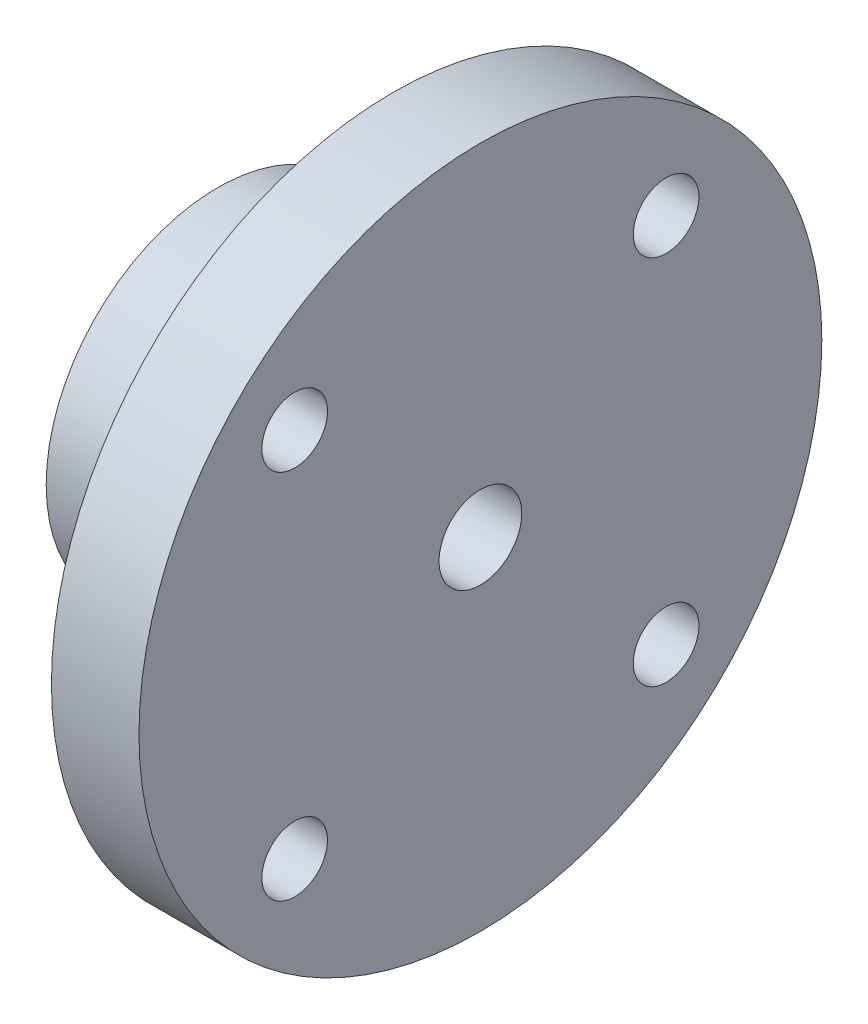
ISO-10303-21;
HEADER;
FILE_DESCRIPTION(('STEP AP214'),'2;1');
FILE_NAME('part.step','',(''),(''),'','','');
FILE_SCHEMA(('AUTOMOTIVE_DESIGN { 1 0 10303 214 1 1 1 1 }'));
ENDSEC;
DATA;
#1=APPLICATION_CONTEXT('core data for automotive mechanical design processes');
#2=APPLICATION_PROTOCOL_DEFINITION('international standard','automotive_design',2000,#1);
#3=PRODUCT_CONTEXT('',#1,'mechanical');
#4=PRODUCT('Part','Part','',(#3));
#5=PRODUCT_RELATED_PRODUCT_CATEGORY('part','',(#4));
#6=PRODUCT_DEFINITION_FORMATION('','',#4);
#7=PRODUCT_DEFINITION_CONTEXT('part definition',#1,'design');
#8=PRODUCT_DEFINITION('design','',#6,#7);
#9=PRODUCT_DEFINITION_SHAPE('','',#8);
#10=(LENGTH_UNIT() NAMED_UNIT(*) SI_UNIT(.MILLI.,.METRE.));
#11=(NAMED_UNIT(*) PLANE_ANGLE_UNIT() SI_UNIT($,.RADIAN.));
#12=(NAMED_UNIT(*) SI_UNIT($,.STERADIAN.) SOLID_ANGLE_UNIT());
#13=UNCERTAINTY_MEASURE_WITH_UNIT(LENGTH_MEASURE(1.E-05),#10,'distance_accuracy_value','');
#14=(GEOMETRIC_REPRESENTATION_CONTEXT(3) GLOBAL_UNCERTAINTY_ASSIGNED_CONTEXT((#13)) GLOBAL_UNIT_ASSIGNED_CONTEXT((#10,
#11,#12)) REPRESENTATION_CONTEXT('',''));
#15=CARTESIAN_POINT('',(0.,0.,0.));
#16=DIRECTION('',(0.,0.,1.));
#17=DIRECTION('',(1.,0.,0.));
#18=AXIS2_PLACEMENT_3D('',#15,#16,#17);
#19=CARTESIAN_POINT('',(3.175,0.,0.));
#20=DIRECTION('',(-1.,0.,0.));
#21=DIRECTION('',(0.,0.,1.));
#22=AXIS2_PLACEMENT_3D('',#19,#20,#21);
#23=CYLINDRICAL_SURFACE('',#22,12.3825);
#24=CARTESIAN_POINT('',(0.,0.,0.));
#25=DIRECTION('',(-1.,0.,0.));
#26=DIRECTION('',(0.,0.,1.));
#27=AXIS2_PLACEMENT_3D('',#24,#25,#26);
#28=CIRCLE('',#27,12.3825);
#29=CARTESIAN_POINT('',(0.,0.,12.3825));
#30=VERTEX_POINT('',#29);
#31=EDGE_CURVE('E19',#30,#30,#28,.F.);
#32=ORIENTED_EDGE('',*,*,#31,.T.);
#33=EDGE_LOOP('',(#32));
#34=FACE_BOUND('',#33,.T.);
#35=CARTESIAN_POINT('',(3.175,0.,0.));
#36=DIRECTION('',(-1.,0.,0.));
#37=DIRECTION('',(0.,0.,1.));
#38=AXIS2_PLACEMENT_3D('',#35,#36,#37);
#39=CIRCLE('',#38,12.3825);
#40=CARTESIAN_POINT('',(3.175,0.,12.3825));
#41=VERTEX_POINT('',#40);
#42=EDGE_CURVE('E75',#41,#41,#39,.F.);
#43=ORIENTED_EDGE('',*,*,#42,.F.);
#44=EDGE_LOOP('',(#43));
#45=FACE_BOUND('',#44,.T.);
#46=ADVANCED_FACE('F15',(#34,#45),#23,.T.);
#47=CARTESIAN_POINT('',(3.175,-6.735192091,-6.735192091));
#48=DIRECTION('',(-1.,0.,0.));
#49=DIRECTION('',(0.,0.,1.));
#50=AXIS2_PLACEMENT_3D('',#47,#48,#49);
#51=CYLINDRICAL_SURFACE('',#50,1.190625);
#52=CARTESIAN_POINT('',(0.,-6.735192091,-6.735192091));
#53=DIRECTION('',(-1.,0.,0.));
#54=DIRECTION('',(0.,0.,1.));
#55=AXIS2_PLACEMENT_3D('',#52,#53,#54);
#56=CIRCLE('',#55,1.190625);
#57=CARTESIAN_POINT('',(0.,-6.735192091,-5.544567091));
#58=VERTEX_POINT('',#57);
#59=EDGE_CURVE('E85',#58,#58,#56,.T.);
#60=ORIENTED_EDGE('',*,*,#59,.T.);
#61=EDGE_LOOP('',(#60));
#62=FACE_BOUND('',#61,.T.);
#63=CARTESIAN_POINT('',(3.175,-6.735192091,-6.735192091));
#64=DIRECTION('',(-1.,0.,0.));
#65=DIRECTION('',(0.,0.,1.));
#66=AXIS2_PLACEMENT_3D('',#63,#64,#65);
#67=CIRCLE('',#66,1.190625);
#68=CARTESIAN_POINT('',(3.175,-6.735192091,-5.544567091));
#69=VERTEX_POINT('',#68);
#70=EDGE_CURVE('E150',#69,#69,#67,.T.);
#71=ORIENTED_EDGE('',*,*,#70,.F.);
#72=EDGE_LOOP('',(#71));
#73=FACE_BOUND('',#72,.T.);
#74=ADVANCED_FACE('F155',(#62,#73),#51,.F.);
#75=CARTESIAN_POINT('',(3.175,-6.735192091,6.735192091));
#76=DIRECTION('',(-1.,0.,0.));
#77=DIRECTION('',(0.,0.,1.));
#78=AXIS2_PLACEMENT_3D('',#75,#76,#77);
#79=CYLINDRICAL_SURFACE('',#78,1.190625);
#80=CARTESIAN_POINT('',(0.,-6.735192091,6.735192091));
#81=DIRECTION('',(-1.,0.,0.));
#82=DIRECTION('',(0.,0.,1.));
#83=AXIS2_PLACEMENT_3D('',#80,#81,#82);
#84=CIRCLE('',#83,1.190625);
#85=CARTESIAN_POINT('',(0.,-6.735192091,7.925817091));
#86=VERTEX_POINT('',#85);
#87=EDGE_CURVE('E83',#86,#86,#84,.T.);
#88=ORIENTED_EDGE('',*,*,#87,.T.);
#89=EDGE_LOOP('',(#88));
#90=FACE_BOUND('',#89,.T.);
#91=CARTESIAN_POINT('',(3.175,-6.735192091,6.735192091));
#92=DIRECTION('',(-1.,0.,0.));
#93=DIRECTION('',(0.,0.,1.));
#94=AXIS2_PLACEMENT_3D('',#91,#92,#93);
#95=CIRCLE('',#94,1.190625);
#96=CARTESIAN_POINT('',(3.175,-6.735192091,7.925817091));
#97=VERTEX_POINT('',#96);
#98=EDGE_CURVE('E146',#97,#97,#95,.T.);
#99=ORIENTED_EDGE('',*,*,#98,.F.);
#100=EDGE_LOOP('',(#99));
#101=FACE_BOUND('',#100,.T.);
#102=ADVANCED_FACE('F159',(#90,#101),#79,.F.);
#103=CARTESIAN_POINT('',(3.175,6.735192091,6.735192091));
#104=DIRECTION('',(-1.,0.,0.));
#105=DIRECTION('',(0.,0.,1.));
#106=AXIS2_PLACEMENT_3D('',#103,#104,#105);
#107=CYLINDRICAL_SURFACE('',#106,1.190625);
#108=CARTESIAN_POINT('',(0.,6.735192091,6.735192091));
#109=DIRECTION('',(-1.,0.,0.));
#110=DIRECTION('',(0.,0.,1.));
#111=AXIS2_PLACEMENT_3D('',#108,#109,#110);
#112=CIRCLE('',#111,1.190625);
#113=CARTESIAN_POINT('',(0.,6.735192091,7.925817091));
#114=VERTEX_POINT('',#113);
#115=EDGE_CURVE('E80',#114,#114,#112,.T.);
#116=ORIENTED_EDGE('',*,*,#115,.T.);
#117=EDGE_LOOP('',(#116));
#118=FACE_BOUND('',#117,.T.);
#119=CARTESIAN_POINT('',(3.175,6.735192091,6.735192091));
#120=DIRECTION('',(-1.,0.,0.));
#121=DIRECTION('',(0.,0.,1.));
#122=AXIS2_PLACEMENT_3D('',#119,#120,#121);
#123=CIRCLE('',#122,1.190625);
#124=CARTESIAN_POINT('',(3.175,6.735192091,7.925817091));
#125=VERTEX_POINT('',#124);
#126=EDGE_CURVE('E142',#125,#125,#123,.T.);
#127=ORIENTED_EDGE('',*,*,#126,.F.);
#128=EDGE_LOOP('',(#127));
#129=FACE_BOUND('',#128,.T.);
#130=ADVANCED_FACE('F163',(#118,#129),#107,.F.);
#131=CARTESIAN_POINT('',(3.175,6.735192091,-6.735192091));
#132=DIRECTION('',(-1.,0.,0.));
#133=DIRECTION('',(0.,0.,1.));
#134=AXIS2_PLACEMENT_3D('',#131,#132,#133);
#135=CYLINDRICAL_SURFACE('',#134,1.190625);
#136=CARTESIAN_POINT('',(0.,6.735192091,-6.735192091));
#137=DIRECTION('',(-1.,0.,0.));
#138=DIRECTION('',(0.,0.,1.));
#139=AXIS2_PLACEMENT_3D('',#136,#137,#138);
#140=CIRCLE('',#139,1.190625);
#141=CARTESIAN_POINT('',(0.,6.735192091,-5.544567091));
#142=VERTEX_POINT('',#141);
#143=EDGE_CURVE('E76',#142,#142,#140,.T.);
#144=ORIENTED_EDGE('',*,*,#143,.T.);
#145=EDGE_LOOP('',(#144));
#146=FACE_BOUND('',#145,.T.);
#147=CARTESIAN_POINT('',(3.175,6.735192091,-6.735192091));
#148=DIRECTION('',(-1.,0.,0.));
#149=DIRECTION('',(0.,0.,1.));
#150=AXIS2_PLACEMENT_3D('',#147,#148,#149);
#151=CIRCLE('',#150,1.190625);
#152=CARTESIAN_POINT('',(3.175,6.735192091,-5.544567091));
#153=VERTEX_POINT('',#152);
#154=EDGE_CURVE('E56',#153,#153,#151,.T.);
#155=ORIENTED_EDGE('',*,*,#154,.F.);
#156=EDGE_LOOP('',(#155));
#157=FACE_BOUND('',#156,.T.);
#158=ADVANCED_FACE('F64',(#146,#157),#135,.F.);
#159=CARTESIAN_POINT('',(-3.175,6.25695273025488,0.));
#160=DIRECTION('',(0.,-1.,0.));
#161=DIRECTION('',(1.,0.,0.));
#162=AXIS2_PLACEMENT_3D('',#159,#160,#161);
#163=CYLINDRICAL_SURFACE('',#162,1.3890625);
#164=CARTESIAN_POINT('',(-3.17500000011396,6.06598997452961,1.3890625));
#165=CARTESIAN_POINT('',(-3.09811006415944,6.06599217922672,1.38905868040349));
#166=CARTESIAN_POINT('',(-3.02112666446025,6.06746937541811,1.38265024311988));
#167=CARTESIAN_POINT('',(-2.86928741773819,6.07321250864021,1.35719635145861));
#168=CARTESIAN_POINT('',(-2.79443600498068,6.07748386985381,1.33812631662936));
#169=CARTESIAN_POINT('',(-2.64917546517182,6.08830741725932,1.28798075919054));
#170=CARTESIAN_POINT('',(-2.57875941837421,6.09485594117176,1.25692450482905));
#171=CARTESIAN_POINT('',(-2.44415685156192,6.10949118253794,1.18373673504967));
#172=CARTESIAN_POINT('',(-2.37996851798402,6.11757745014493,1.14160845723362));
#173=CARTESIAN_POINT('',(-2.2584811026932,6.13453833085786,1.0466728938705));
#174=CARTESIAN_POINT('',(-2.2013079484898,6.14342344393786,0.993706294264336));
#175=CARTESIAN_POINT('',(-2.09657645865613,6.16088945408051,0.878938922914779));
#176=CARTESIAN_POINT('',(-2.04901940871729,6.16947031033715,0.817136971751238));
#177=CARTESIAN_POINT('',(-1.96437777314316,6.18547403954004,0.685615995342867));
#178=CARTESIAN_POINT('',(-1.9274135723458,6.19288320263398,0.615817683132399));
#179=CARTESIAN_POINT('',(-1.86578675756034,6.20559097929397,0.470807350225378));
#180=CARTESIAN_POINT('',(-1.84112260430311,6.21088985693149,0.395596008282198));
#181=CARTESIAN_POINT('',(-1.80518978319658,6.21870644289575,0.24319461858624));
#182=CARTESIAN_POINT('',(-1.79370940378417,6.22126805947162,0.166056777849254));
#183=CARTESIAN_POINT('',(-1.78380773707804,6.22347374938127,0.0109102014321965));
#184=CARTESIAN_POINT('',(-1.78538491517028,6.22311816556456,-0.0670984308303188));
#185=CARTESIAN_POINT('',(-1.80139661763737,6.21956296294512,-0.220310792785113));
#186=CARTESIAN_POINT('',(-1.81560280052543,6.21641385520967,-0.295539730809042));
#187=CARTESIAN_POINT('',(-1.85610513553392,6.20768312867522,-0.442518624580058));
#188=CARTESIAN_POINT('',(-1.88240193416664,6.20210137979828,-0.514268394061386));
#189=CARTESIAN_POINT('',(-1.9465395478409,6.18905165545756,-0.652883185654913));
#190=CARTESIAN_POINT('',(-1.98446653435117,6.1815696742105,-0.719706963092924));
#191=CARTESIAN_POINT('',(-2.07072071519305,6.16553942255323,-0.846119641666087));
#192=CARTESIAN_POINT('',(-2.1190486496397,6.15699107628036,-0.905708027469951));
#193=CARTESIAN_POINT('',(-2.22596430024307,6.13954947547536,-1.01731254714392));
#194=CARTESIAN_POINT('',(-2.28475012719988,6.13065275651723,-1.06913849995622));
#195=CARTESIAN_POINT('',(-2.41029910600272,6.11368469116566,-1.16225489314144));
#196=CARTESIAN_POINT('',(-2.47706577556011,6.10561371166338,-1.20354066239596));
#197=CARTESIAN_POINT('',(-2.61701658588749,6.0912000747929,-1.27449273562706));
#198=CARTESIAN_POINT('',(-2.69022511471871,6.08486439480695,-1.30411233469653));
#199=CARTESIAN_POINT('',(-2.84066408078581,6.07473592245639,-1.35051307820957));
#200=CARTESIAN_POINT('',(-2.91788567571255,6.0709377752913,-1.36732126842029));
#201=CARTESIAN_POINT('',(-3.02559826954119,6.06775615915351,-1.38133049127282));
#202=CARTESIAN_POINT('',(-3.05539688525944,6.06709548584937,-1.38422736042052));
#203=CARTESIAN_POINT('',(-3.1151256086696,6.06621196369546,-1.3880941109171));
#204=CARTESIAN_POINT('',(-3.14505571668523,6.06598911592419,-1.38906398751922));
#205=CARTESIAN_POINT('',(-3.25188993594891,6.06599217922808,-1.38905868039756));
#206=CARTESIAN_POINT('',(-3.32887333564875,6.06746937542088,-1.38265024310781));
#207=CARTESIAN_POINT('',(-3.48071258237093,6.0732125086457,-1.35719635143408));
#208=CARTESIAN_POINT('',(-3.55556399512791,6.07748386986063,-1.33812631659853));
#209=CARTESIAN_POINT('',(-3.70082453493354,6.08830741726845,-1.28798075914753));
#210=CARTESIAN_POINT('',(-3.77124058172852,6.09485594118184,-1.25692450478031));
#211=CARTESIAN_POINT('',(-3.9058431485347,6.10949118254953,-1.18373673499001));
#212=CARTESIAN_POINT('',(-3.97003148210912,6.11757745015707,-1.14160845716875));
#213=CARTESIAN_POINT('',(-4.09151889739249,6.1345383308707,-1.04667289379549));
#214=CARTESIAN_POINT('',(-4.14869205159187,6.14342344395084,-0.993706294184351));
#215=CARTESIAN_POINT('',(-4.25342354141668,6.16088945409329,-0.87893892282549));
#216=CARTESIAN_POINT('',(-4.30098059135068,6.16947031034959,-0.817136971657625));
#217=CARTESIAN_POINT('',(-4.38562222691409,6.18547403955128,-0.685615995241783));
#218=CARTESIAN_POINT('',(-4.42258642770562,6.19288320264437,-0.615817683028224));
#219=CARTESIAN_POINT('',(-4.48421324247897,6.2055909793023,-0.470807350116047));
#220=CARTESIAN_POINT('',(-4.50887739572993,6.2108898569386,-0.395596008170801));
#221=CARTESIAN_POINT('',(-4.54481021682364,6.21870644290022,-0.243194618472236));
#222=CARTESIAN_POINT('',(-4.55629059622957,6.22126805947468,-0.166056777734705));
#223=CARTESIAN_POINT('',(-4.56619226292284,6.22347374938147,-0.0109102013177001));
#224=CARTESIAN_POINT('',(-4.56461508482419,6.22311816556332,0.0670984309442183));
#225=CARTESIAN_POINT('',(-4.54860338234466,6.21956296294115,0.220310792897062));
#226=CARTESIAN_POINT('',(-4.53439719945051,6.21641385520439,0.29553973091965));
#227=CARTESIAN_POINT('',(-4.49389486443019,6.20768312866758,0.442518624686999));
#228=CARTESIAN_POINT('',(-4.46759806579172,6.20210137978958,0.514268394166));
#229=CARTESIAN_POINT('',(-4.40346045210623,6.18905165544704,0.65288318575443));
#230=CARTESIAN_POINT('',(-4.36553346559039,6.18156967419921,0.719706963189629));
#231=CARTESIAN_POINT('',(-4.27927928473785,6.16553942254082,0.846119641756289));
#232=CARTESIAN_POINT('',(-4.23095135028612,6.1569910762676,0.905708027556461));
#233=CARTESIAN_POINT('',(-4.12403569967312,6.13954947546237,1.01731254722213));
#234=CARTESIAN_POINT('',(-4.06524987271179,6.13065275650436,1.0691385000298));
#235=CARTESIAN_POINT('',(-3.93970089390062,6.11368469115353,1.16225489320506));
#236=CARTESIAN_POINT('',(-3.87293422433943,6.10561371165185,1.20354066245424));
#237=CARTESIAN_POINT('',(-3.73298341400583,6.09120007478309,1.27449273567376));
#238=CARTESIAN_POINT('',(-3.65977488517223,6.08486439479823,1.30411233473707));
#239=CARTESIAN_POINT('',(-3.50933591910154,6.07473592245017,1.35051307823744));
#240=CARTESIAN_POINT('',(-3.43211432417358,6.07093777528646,1.36732126844168));
#241=CARTESIAN_POINT('',(-3.32440173038084,6.06775615915177,1.38133049128045));
#242=CARTESIAN_POINT('',(-3.29460311469942,6.06709548584874,1.38422736042327));
#243=CARTESIAN_POINT('',(-3.23487439136325,6.06621196369597,1.38809411091488));
#244=CARTESIAN_POINT('',(-3.20494428338477,6.06598911592473,1.38906398751691));
#245=CARTESIAN_POINT('',(-3.17500000011396,6.06598997452961,1.3890625));
#246=B_SPLINE_CURVE_WITH_KNOTS('',3,(#164,#165,#166,#167,#168,#169,#170,#171,#172,#173,#174,
#175,#176,#177,#178,#179,#180,#181,#182,#183,#184,#185,#186,#187,#188,#189,#190,#191,#192,#193,
#194,#195,#196,#197,#198,#199,#200,#201,#202,#203,#204,#205,#206,#207,#208,#209,#210,#211,#212,
#213,#214,#215,#216,#217,#218,#219,#220,#221,#222,#223,#224,#225,#226,#227,#228,#229,#230,#231,
#232,#233,#234,#235,#236,#237,#238,#239,#240,#241,#242,#243,#244,#245),.UNSPECIFIED.,.T.,.F.,(4,
2,2,2,2,2,2,2,2,2,2,2,2,2,2,2,2,2,2,2,2,2,2,2,2,2,2,2,2,2,2,2,2,2,2,2,2,2,2,2,4),(0.,
0.230555019325299,0.4615589379102,0.692193046371755,0.922759789348866,1.1569966984772,
1.39126490484742,1.62809853413737,1.86490251783189,2.09784813553214,2.33076637624882,
2.55955705179012,2.78835996270408,3.01890086925003,3.24945818615037,3.48496868375749,
3.72058337264286,3.95713197132167,4.19317980583598,4.28296773093861,4.37275587721589,
4.60331089654477,4.83431481513295,5.06494892359447,5.29551566657162,5.52975257570126,
5.76402078207277,6.00085441136249,6.23765839505677,6.47060401275565,6.70352225347098,
6.93231292901189,7.16111583992548,7.39165674647255,7.622214063374,7.85772456098207,
8.09333924986847,8.32988784854673,8.56593568306014,8.65572360805157,8.74551175421765),.UNSPECIFIED.);
#247=CARTESIAN_POINT('',(-3.17500000011396,6.06598997452961,1.3890625));
#248=VERTEX_POINT('',#247);
#249=EDGE_CURVE('E69',#248,#248,#246,.T.);
#250=ORIENTED_EDGE('',*,*,#249,.T.);
#251=EDGE_LOOP('',(#250));
#252=FACE_BOUND('',#251,.T.);
#253=CARTESIAN_POINT('',(-3.17500000265396,0.566131937890353,1.38906250002586));
#254=CARTESIAN_POINT('',(-3.13694451784908,0.56613637078519,1.3890613503542));
#255=CARTESIAN_POINT('',(-3.09888214365958,0.570073242006744,1.38747438867191));
#256=CARTESIAN_POINT('',(-3.02424248625585,0.584696740501921,1.38137125987598));
#257=CARTESIAN_POINT('',(-2.98767378761954,0.59541776293997,1.37684016304787));
#258=CARTESIAN_POINT('',(-2.89791294412656,0.628256170940902,1.36225982524225));
#259=CARTESIAN_POINT('',(-2.84615597103486,0.653402039732897,1.35055961884621));
#260=CARTESIAN_POINT('',(-2.74674985574123,0.708660042943076,1.32241381769489));
#261=CARTESIAN_POINT('',(-2.69911754037834,0.738791183495466,1.30594987420841));
#262=CARTESIAN_POINT('',(-2.6098272496381,0.799328395105556,1.26974272726648));
#263=CARTESIAN_POINT('',(-2.5679824599643,0.829611791730389,1.2502524433848));
#264=CARTESIAN_POINT('',(-2.48675099896436,0.89077679967322,1.20744222916994));
#265=CARTESIAN_POINT('',(-2.44736616349926,0.92165883575575,1.18411948471273));
#266=CARTESIAN_POINT('',(-2.33278147894618,1.01377724728472,1.10839860025836));
#267=CARTESIAN_POINT('',(-2.26094544870498,1.07463651324975,1.05016371346534));
#268=CARTESIAN_POINT('',(-2.14503469861716,1.17505984083077,0.93461893178728));
#269=CARTESIAN_POINT('',(-2.09857575229599,1.21607083517548,0.880935752729396));
#270=CARTESIAN_POINT('',(-2.01298069408482,1.29244487244515,0.764466639505674));
#271=CARTESIAN_POINT('',(-1.97383175455568,1.32781779281122,0.701697000684656));
#272=CARTESIAN_POINT('',(-1.91196107195702,1.38406863900515,0.581229147426247));
#273=CARTESIAN_POINT('',(-1.88751725973316,1.40643148093303,0.525115255285228));
#274=CARTESIAN_POINT('',(-1.84581476263747,1.44470387018345,0.408173135640683));
#275=CARTESIAN_POINT('',(-1.82855186843281,1.46061719796131,0.347347694844339));
#276=CARTESIAN_POINT('',(-1.80228639744449,1.48486442987423,0.221983583654817));
#277=CARTESIAN_POINT('',(-1.79334115114988,1.49314572580644,0.157422352977044));
#278=CARTESIAN_POINT('',(-1.78467269877125,1.50117033984526,0.0271617910189906));
#279=CARTESIAN_POINT('',(-1.78494504873747,1.50091777226331,-0.0385369765667989));
#280=CARTESIAN_POINT('',(-1.79412461250375,1.49242087420961,-0.16139712678156));
#281=CARTESIAN_POINT('',(-1.80207156961796,1.48506528930177,-0.218697773635406));
#282=CARTESIAN_POINT('',(-1.82468420661982,1.46418556247626,-0.330774167287795));
#283=CARTESIAN_POINT('',(-1.83935090578185,1.45066048474934,-0.385549529654413));
#284=CARTESIAN_POINT('',(-1.87527669356705,1.41765070410367,-0.493538522818222));
#285=CARTESIAN_POINT('',(-1.89677086264733,1.39795389060207,-0.546607627042664));
#286=CARTESIAN_POINT('',(-1.94512404440145,1.35388415735177,-0.648125549859769));
#287=CARTESIAN_POINT('',(-1.97198568250177,1.32950894945953,-0.696572090184636));
#288=CARTESIAN_POINT('',(-2.0454352092702,1.26334619001965,-0.812688909989209));
#289=CARTESIAN_POINT('',(-2.09498013328373,1.219131238794,-0.877115358415202));
#290=CARTESIAN_POINT('',(-2.20203301706007,1.12538928566003,-0.994574695116265));
#291=CARTESIAN_POINT('',(-2.25956318044789,1.07584756191356,-1.04757472408646));
#292=CARTESIAN_POINT('',(-2.3827555349153,0.973101906664263,-1.14372797309536));
#293=CARTESIAN_POINT('',(-2.44858475125593,0.919837455631937,-1.18660265591469));
#294=CARTESIAN_POINT('',(-2.55256343394237,0.84109300581107,-1.24241881907491));
#295=CARTESIAN_POINT('',(-2.58807725406096,0.815049062988456,-1.25960204545565));
#296=CARTESIAN_POINT('',(-2.66112563861144,0.764120265173408,-1.29112809331476));
#297=CARTESIAN_POINT('',(-2.69865860684696,0.739234522794626,-1.30547311769878));
#298=CARTESIAN_POINT('',(-2.77364160187412,0.693376586155886,-1.33036234118494));
#299=CARTESIAN_POINT('',(-2.81093622442226,0.672254846135701,-1.3410938754599));
#300=CARTESIAN_POINT('',(-2.88813823798127,0.633779433072223,-1.35969757671414));
#301=CARTESIAN_POINT('',(-2.92804202237812,0.616420696033295,-1.36757359617888));
#302=CARTESIAN_POINT('',(-3.00229436226329,0.591086067226802,-1.37868479675069));
#303=CARTESIAN_POINT('',(-3.03612511006408,0.581920547775767,-1.38253765739833));
#304=CARTESIAN_POINT('',(-3.10497221567012,0.569453291228777,-1.38772194274289));
#305=CARTESIAN_POINT('',(-3.13998319225981,0.566127858673159,-1.38906355798687));
#306=CARTESIAN_POINT('',(-3.21305548715231,0.566136371082025,-1.38906135020356));
#307=CARTESIAN_POINT('',(-3.25111786173776,0.570073242708159,-1.38747438837839));
#308=CARTESIAN_POINT('',(-3.32575751985897,0.584696742062274,-1.38137125922625));
#309=CARTESIAN_POINT('',(-3.36232621881543,0.595417764958383,-1.37684016218294));
#310=CARTESIAN_POINT('',(-3.45208706361194,0.628256174292068,-1.36225982370817));
#311=CARTESIAN_POINT('',(-3.50384403759931,0.653402044051901,-1.35055961678063));
#312=CARTESIAN_POINT('',(-3.60325015456329,0.708660049151038,-1.32241381439627));
#313=CARTESIAN_POINT('',(-3.65088247070139,0.738791190623273,-1.30594987020866));
#314=CARTESIAN_POINT('',(-3.74017276216121,0.799328403462266,-1.26974272201989));
#315=CARTESIAN_POINT('',(-3.78201755183083,0.829611800369996,-1.25025243766614));
#316=CARTESIAN_POINT('',(-3.86324901281811,0.89077680878499,-1.20744222246261));
#317=CARTESIAN_POINT('',(-3.90263384827479,0.921658845056703,-1.18411947748886));
#318=CARTESIAN_POINT('',(-4.01721853275713,1.01377725702965,-1.10839859141072));
#319=CARTESIAN_POINT('',(-4.08905456290205,1.0746365231357,-1.05016370342954));
#320=CARTESIAN_POINT('',(-4.20496531174037,1.17505984992365,-0.934618920326513));
#321=CARTESIAN_POINT('',(-4.25142425707006,1.21607084347469,-0.880935741233161));
#322=CARTESIAN_POINT('',(-4.3370193133484,1.29244487913655,-0.764466628147812));
#323=CARTESIAN_POINT('',(-4.37616825193581,1.32781779868828,-0.701696989499867));
#324=CARTESIAN_POINT('',(-4.43803893309214,1.38406864361493,-0.581229136437874));
#325=CARTESIAN_POINT('',(-4.46248274476245,1.40643148504983,-0.525115244240474));
#326=CARTESIAN_POINT('',(-4.50418524074402,1.44470387329595,-0.408173124600383));
#327=CARTESIAN_POINT('',(-4.52144813438816,1.46061720056254,-0.347347683864829));
#328=CARTESIAN_POINT('',(-4.54771360427445,1.48486443146408,-0.221983572951449));
#329=CARTESIAN_POINT('',(-4.55665885002963,1.49314572689807,-0.15742234249074));
#330=CARTESIAN_POINT('',(-4.56532730140783,1.50117034001133,-0.0271617811028737));
#331=CARTESIAN_POINT('',(-4.56505495098014,1.5009177720016,0.0385369861299129));
#332=CARTESIAN_POINT('',(-4.55587538643722,1.49242087322957,0.161397135800598));
#333=CARTESIAN_POINT('',(-4.54792842896866,1.48506528799474,0.218697782469582));
#334=CARTESIAN_POINT('',(-4.52531579131528,1.46418556057157,0.330774175692347));
#335=CARTESIAN_POINT('',(-4.510649091856,1.45066048257392,0.385549537814171));
#336=CARTESIAN_POINT('',(-4.474723303444,1.41765070136256,0.493538530700907));
#337=CARTESIAN_POINT('',(-4.45322913400733,1.39795388754201,0.546607634873803));
#338=CARTESIAN_POINT('',(-4.40487595155781,1.35388415367992,0.648125557534267));
#339=CARTESIAN_POINT('',(-4.37801431311854,1.32950894549489,0.69657209775404));
#340=CARTESIAN_POINT('',(-4.30456478537636,1.26334618522771,0.81268891746823));
#341=CARTESIAN_POINT('',(-4.25501986070703,1.21913123346084,0.877115365847694));
#342=CARTESIAN_POINT('',(-4.14796697559486,1.12538927929943,0.994574702331628));
#343=CARTESIAN_POINT('',(-4.09043681152632,1.0758475550665,1.04757473112991));
#344=CARTESIAN_POINT('',(-3.96724445562031,0.973101898934214,1.14372797968203));
#345=CARTESIAN_POINT('',(-3.90141523851952,0.919837447507735,1.18660266221196));
#346=CARTESIAN_POINT('',(-3.79743655458024,0.841092997304859,1.24241882483369));
#347=CARTESIAN_POINT('',(-3.76192273402518,0.815049054389554,1.25960205101777));
#348=CARTESIAN_POINT('',(-3.68887434854058,0.76412025651148,1.2911280984389));
#349=CARTESIAN_POINT('',(-3.65134137980765,0.73923451416217,1.30547312258188));
#350=CARTESIAN_POINT('',(-3.57635838445162,0.693376578233693,1.33036234529984));
#351=CARTESIAN_POINT('',(-3.53906376212069,0.67225483883931,1.34109387910326));
#352=CARTESIAN_POINT('',(-3.46186174903482,0.633779427190466,1.3596975794434));
#353=CARTESIAN_POINT('',(-3.42195796489589,0.616420690937363,1.36757359846767));
#354=CARTESIAN_POINT('',(-3.34770562791083,0.591086064470358,1.37868479791572));
#355=CARTESIAN_POINT('',(-3.31387488285669,0.58192054625345,1.38253765802866));
#356=CARTESIAN_POINT('',(-3.2450277829758,0.569453291221004,1.38772194274846));
#357=CARTESIAN_POINT('',(-3.21001680936198,0.56612785895607,1.38906355789782));
#358=CARTESIAN_POINT('',(-3.17500000265396,0.566131937890353,1.38906250002586));
#359=B_SPLINE_CURVE_WITH_KNOTS('',3,(#253,#254,#255,#256,#257,#258,#259,#260,#261,#262,#263,
#264,#265,#266,#267,#268,#269,#270,#271,#272,#273,#274,#275,#276,#277,#278,#279,#280,#281,#282,
#283,#284,#285,#286,#287,#288,#289,#290,#291,#292,#293,#294,#295,#296,#297,#298,#299,#300,#301,
#302,#303,#304,#305,#306,#307,#308,#309,#310,#311,#312,#313,#314,#315,#316,#317,#318,#319,#320,
#321,#322,#323,#324,#325,#326,#327,#328,#329,#330,#331,#332,#333,#334,#335,#336,#337,#338,#339,
#340,#341,#342,#343,#344,#345,#346,#347,#348,#349,#350,#351,#352,#353,#354,#355,#356,#357,#358),
.UNSPECIFIED.,.T.,.F.,(4,2,2,2,2,2,2,2,2,2,2,2,2,2,2,2,2,2,2,2,2,2,2,2,2,2,2,2,2,2,2,2,2,2,2,2,
2,2,2,2,2,2,2,2,2,2,2,2,2,2,2,2,4),(0.,0.113992115833275,0.228566845395369,0.40372851220296,
0.579574050068104,0.744972992175249,0.910493931696776,1.24073847974711,1.48590456963309,
1.73063631230884,1.9253633616509,2.11997610388424,2.31592050720931,2.51177044396743,
2.68591637348403,2.86008872682451,3.04106292417412,3.22212586030935,3.49815072980797,
3.77495908639672,4.05867085714783,4.20039137588073,4.34200146120117,4.47434162176377,
4.6065025667959,4.71182089032738,4.81671090135588,4.93070301849743,5.04527774943324,
5.22043942015351,5.396284961907,5.56168390497111,5.72720484544603,6.05744939535448,
6.3026154824455,6.54734722234176,6.74207427069823,6.93668701194558,7.13263141423358,
7.32848134996427,7.50262727921171,7.67679963228469,7.85777383018968,8.03883676687957,
8.31486163810051,8.59166999643905,8.87538176902438,9.01710228867594,9.15871237490172,
9.29105253366895,9.42321347680887,9.52853179139744,9.63342179363598),.UNSPECIFIED.);
#360=CARTESIAN_POINT('',(-3.17500000265396,0.566131937890353,1.38906250002586));
#361=VERTEX_POINT('',#360);
#362=EDGE_CURVE('E49',#361,#361,#359,.T.);
#363=ORIENTED_EDGE('',*,*,#362,.F.);
#364=EDGE_LOOP('',(#363));
#365=FACE_BOUND('',#364,.T.);
#366=ADVANCED_FACE('F59',(#252,#365),#163,.F.);
#367=CARTESIAN_POINT('',(0.,-12.53109,12.53109));
#368=DIRECTION('',(1.,0.,0.));
#369=DIRECTION('',(0.,0.,-1.));
#370=AXIS2_PLACEMENT_3D('',#367,#368,#369);
#371=PLANE('',#370);
#372=CARTESIAN_POINT('',(0.,0.,0.));
#373=DIRECTION('',(1.,0.,0.));
#374=DIRECTION('',(0.,0.,-1.));
#375=AXIS2_PLACEMENT_3D('',#372,#373,#374);
#376=CIRCLE('',#375,6.223);
#377=CARTESIAN_POINT('',(0.,0.,-6.223));
#378=VERTEX_POINT('',#377);
#379=EDGE_CURVE('E55',#378,#378,#376,.T.);
#380=ORIENTED_EDGE('',*,*,#379,.T.);
#381=EDGE_LOOP('',(#380));
#382=FACE_BOUND('',#381,.T.);
#383=ORIENTED_EDGE('',*,*,#143,.F.);
#384=EDGE_LOOP('',(#383));
#385=FACE_BOUND('',#384,.T.);
#386=ORIENTED_EDGE('',*,*,#115,.F.);
#387=EDGE_LOOP('',(#386));
#388=FACE_BOUND('',#387,.T.);
#389=ORIENTED_EDGE('',*,*,#87,.F.);
#390=EDGE_LOOP('',(#389));
#391=FACE_BOUND('',#390,.T.);
#392=ORIENTED_EDGE('',*,*,#59,.F.);
#393=EDGE_LOOP('',(#392));
#394=FACE_BOUND('',#393,.T.);
#395=ORIENTED_EDGE('',*,*,#31,.F.);
#396=EDGE_LOOP('',(#395));
#397=FACE_BOUND('',#396,.T.);
#398=ADVANCED_FACE('F63',(#382,#385,#388,#391,#394,#397),#371,.F.);
#399=CARTESIAN_POINT('',(-6.35,-6.297676,-6.297676));
#400=DIRECTION('',(-1.,0.,0.));
#401=DIRECTION('',(0.,0.,1.));
#402=AXIS2_PLACEMENT_3D('',#399,#400,#401);
#403=PLANE('',#402);
#404=CARTESIAN_POINT('',(-6.35,0.,0.));
#405=DIRECTION('',(1.,0.,0.));
#406=DIRECTION('',(0.,0.,-1.));
#407=AXIS2_PLACEMENT_3D('',#404,#405,#406);
#408=CIRCLE('',#407,1.5);
#409=CARTESIAN_POINT('',(-6.35,0.,-1.5));
#410=VERTEX_POINT('',#409);
#411=EDGE_CURVE('E128',#410,#410,#408,.F.);
#412=ORIENTED_EDGE('',*,*,#411,.F.);
#413=EDGE_LOOP('',(#412));
#414=FACE_BOUND('',#413,.T.);
#415=CARTESIAN_POINT('',(-6.35,0.,0.));
#416=DIRECTION('',(1.,0.,0.));
#417=DIRECTION('',(0.,0.,-1.));
#418=AXIS2_PLACEMENT_3D('',#415,#416,#417);
#419=CIRCLE('',#418,6.223);
#420=CARTESIAN_POINT('',(-6.35,0.,-6.223));
#421=VERTEX_POINT('',#420);
#422=EDGE_CURVE('E126',#421,#421,#419,.F.);
#423=ORIENTED_EDGE('',*,*,#422,.T.);
#424=EDGE_LOOP('',(#423));
#425=FACE_BOUND('',#424,.T.);
#426=ADVANCED_FACE('F95',(#414,#425),#403,.T.);
#427=CARTESIAN_POINT('',(3.175,-12.53109,12.53109));
#428=DIRECTION('',(1.,0.,0.));
#429=DIRECTION('',(0.,0.,-1.));
#430=AXIS2_PLACEMENT_3D('',#427,#428,#429);
#431=PLANE('',#430);
#432=CARTESIAN_POINT('',(3.175,0.,0.));
#433=DIRECTION('',(1.,0.,0.));
#434=DIRECTION('',(0.,0.,-1.));
#435=AXIS2_PLACEMENT_3D('',#432,#433,#434);
#436=CIRCLE('',#435,1.5);
#437=CARTESIAN_POINT('',(3.175,0.,-1.5));
#438=VERTEX_POINT('',#437);
#439=EDGE_CURVE('E28',#438,#438,#436,.T.);
#440=ORIENTED_EDGE('',*,*,#439,.F.);
#441=EDGE_LOOP('',(#440));
#442=FACE_BOUND('',#441,.T.);
#443=ORIENTED_EDGE('',*,*,#154,.T.);
#444=EDGE_LOOP('',(#443));
#445=FACE_BOUND('',#444,.T.);
#446=ORIENTED_EDGE('',*,*,#126,.T.);
#447=EDGE_LOOP('',(#446));
#448=FACE_BOUND('',#447,.T.);
#449=ORIENTED_EDGE('',*,*,#98,.T.);
#450=EDGE_LOOP('',(#449));
#451=FACE_BOUND('',#450,.T.);
#452=ORIENTED_EDGE('',*,*,#70,.T.);
#453=EDGE_LOOP('',(#452));
#454=FACE_BOUND('',#453,.T.);
#455=ORIENTED_EDGE('',*,*,#42,.T.);
#456=EDGE_LOOP('',(#455));
#457=FACE_BOUND('',#456,.T.);
#458=ADVANCED_FACE('F17',(#442,#445,#448,#451,#454,#457),#431,.T.);
#459=CARTESIAN_POINT('',(-6.35,0.,0.));
#460=DIRECTION('',(1.,0.,0.));
#461=DIRECTION('',(0.,0.,-1.));
#462=AXIS2_PLACEMENT_3D('',#459,#460,#461);
#463=CYLINDRICAL_SURFACE('',#462,6.223);
#464=ORIENTED_EDGE('',*,*,#422,.F.);
#465=EDGE_LOOP('',(#464));
#466=FACE_BOUND('',#465,.T.);
#467=ORIENTED_EDGE('',*,*,#379,.F.);
#468=EDGE_LOOP('',(#467));
#469=FACE_BOUND('',#468,.T.);
#470=CARTESIAN_POINT('',(-3.17500000014967,-6.06598997422828,1.38906249962186));
#471=CARTESIAN_POINT('',(-3.25188993612184,-6.06599217873096,1.38905867976256));
#472=CARTESIAN_POINT('',(-3.3288733358372,-6.06746937529178,1.3826502429191));
#473=CARTESIAN_POINT('',(-3.48071258255037,-6.07321250878899,1.35719635156141));
#474=CARTESIAN_POINT('',(-3.55556399528351,-6.07748386990648,1.33812631659846));
#475=CARTESIAN_POINT('',(-3.70082453505435,-6.08830741724325,1.28798075905227));
#476=CARTESIAN_POINT('',(-3.7712405818379,-6.09485594118308,1.25692450471564));
#477=CARTESIAN_POINT('',(-3.90584314863647,-6.10949118257125,1.18373673493987));
#478=CARTESIAN_POINT('',(-3.9700314822133,-6.11757745017318,1.1416084571));
#479=CARTESIAN_POINT('',(-4.09151889749694,-6.13453833088369,1.046672893701));
#480=CARTESIAN_POINT('',(-4.14869205169447,-6.14342344396642,0.993706294083276));
#481=CARTESIAN_POINT('',(-4.25342354150784,-6.16088945411003,0.87893892271423));
#482=CARTESIAN_POINT('',(-4.30098059143329,-6.16947031036491,0.817136971543705));
#483=CARTESIAN_POINT('',(-4.38562222698093,-6.18547403956422,0.685615995123328));
#484=CARTESIAN_POINT('',(-4.42258642776497,-6.19288320265631,0.61581768290773));
#485=CARTESIAN_POINT('',(-4.48421324252449,-6.20559097931198,0.470807349989793));
#486=CARTESIAN_POINT('',(-4.50887739576864,-6.21088985694695,0.395596008040615));
#487=CARTESIAN_POINT('',(-4.54481021684766,-6.21870644290552,0.243194618336962));
#488=CARTESIAN_POINT('',(-4.55629059624597,-6.22126805947832,0.166056777598315));
#489=CARTESIAN_POINT('',(-4.56619226292385,-6.2234737493817,0.0109102011813714));
#490=CARTESIAN_POINT('',(-4.56461508481761,-6.22311816556184,-0.0670984310793598));
#491=CARTESIAN_POINT('',(-4.54860338232344,-6.21956296293645,-0.220310793029293));
#492=CARTESIAN_POINT('',(-4.53439719942211,-6.21641385519816,-0.295539731050168));
#493=CARTESIAN_POINT('',(-4.49389486438784,-6.20768312865856,-0.442518624813193));
#494=CARTESIAN_POINT('',(-4.46759806574255,-6.2021013797793,-0.514268394289572));
#495=CARTESIAN_POINT('',(-4.4034604520437,-6.18905165543459,-0.652883185872129));
#496=CARTESIAN_POINT('',(-4.36553346552125,-6.18156967418585,-0.719706963304033));
#497=CARTESIAN_POINT('',(-4.27927928465612,-6.16553942252613,-0.846119641862995));
#498=CARTESIAN_POINT('',(-4.2309513501984,-6.15699107625251,-0.905708027658771));
#499=CARTESIAN_POINT('',(-4.12403569957405,-6.139549475447,-1.01731254731457));
#500=CARTESIAN_POINT('',(-4.06524987260739,-6.13065275648915,-1.06913850011676));
#501=CARTESIAN_POINT('',(-3.93970089378639,-6.11368469113919,-1.16225489328025));
#502=CARTESIAN_POINT('',(-3.87293422422068,-6.10561371163823,-1.20354066252313));
#503=CARTESIAN_POINT('',(-3.73298341387962,-6.09120007477149,-1.27449273572902));
#504=CARTESIAN_POINT('',(-3.65977488504312,-6.08486439478792,-1.30411233478506));
#505=CARTESIAN_POINT('',(-3.50933591896813,-6.0747359224428,-1.35051307827045));
#506=CARTESIAN_POINT('',(-3.43211432403879,-6.07093777528075,-1.36732126846701));
#507=CARTESIAN_POINT('',(-3.32440173035088,-6.06775615915155,-1.38133049128138));
#508=CARTESIAN_POINT('',(-3.29460311477573,-6.06709548585077,-1.38422736041437));
#509=CARTESIAN_POINT('',(-3.23487439165276,-6.06621196369935,-1.3880941109001));
#510=CARTESIAN_POINT('',(-3.20494428378122,-6.06598911592721,-1.38906398750606));
#511=CARTESIAN_POINT('',(-3.0981100646588,-6.06599217922034,-1.38905868043134));
#512=CARTESIAN_POINT('',(-3.0211266649532,-6.0674693754055,-1.38265024317496));
#513=CARTESIAN_POINT('',(-2.86928741821372,-6.07321250861616,-1.35719635156598));
#514=CARTESIAN_POINT('',(-2.7944360054452,-6.07748386982457,-1.33812631676172));
#515=CARTESIAN_POINT('',(-2.64917546561811,-6.08830741722071,-1.28798075937254));
#516=CARTESIAN_POINT('',(-2.57875941881284,-6.09485594112873,-1.25692450503691));
#517=CARTESIAN_POINT('',(-2.44415685198096,-6.1094911824877,-1.18373673530816));
#518=CARTESIAN_POINT('',(-2.37996851839112,-6.11757745009188,-1.14160845751688));
#519=CARTESIAN_POINT('',(-2.25848110307046,-6.13453833080134,-1.04667289420071));
#520=CARTESIAN_POINT('',(-2.20130794884928,-6.14342344388072,-0.993706294616423));
#521=CARTESIAN_POINT('',(-2.09657645897654,-6.16088945402426,-0.878938923307743));
#522=CARTESIAN_POINT('',(-2.0490194090164,-6.16947031028241,-0.817136972163203));
#523=CARTESIAN_POINT('',(-1.9643777733951,-6.18547403949057,-0.685615995787731));
#524=CARTESIAN_POINT('',(-1.92741357257214,-6.19288320258826,-0.615817683590922));
#525=CARTESIAN_POINT('',(-1.86578675773339,-6.20559097925734,-0.470807350706601));
#526=CARTESIAN_POINT('',(-1.8411226044485,-6.21088985690019,-0.395596008772453));
#527=CARTESIAN_POINT('',(-1.80518978328549,-6.21870644287609,-0.243194619087679));
#528=CARTESIAN_POINT('',(-1.79370940384459,-6.22126805945818,-0.166056778352852));
#529=CARTESIAN_POINT('',(-1.78380773708189,-6.22347374938038,-0.0109102019355609));
#530=CARTESIAN_POINT('',(-1.78538491514599,-6.22311816557002,0.0670984303293419));
#531=CARTESIAN_POINT('',(-1.80139661755824,-6.21956296296263,0.220310792291732));
#532=CARTESIAN_POINT('',(-1.81560280041928,-6.21641385523298,0.295539730320819));
#533=CARTESIAN_POINT('',(-1.85610513537545,-6.20768312870897,0.442518624108023));
#534=CARTESIAN_POINT('',(-1.88240193398312,-6.20210137983663,0.514268393600313));
#535=CARTESIAN_POINT('',(-1.94653954760918,-6.1890516555037,0.652883185219066));
#536=CARTESIAN_POINT('',(-1.98446653409625,-6.18156967425983,0.719706962671421));
#537=CARTESIAN_POINT('',(-2.07072071489187,-6.16553942260726,0.84611964127258));
#538=CARTESIAN_POINT('',(-2.11904864931487,-6.15699107633596,0.90570802709052));
#539=CARTESIAN_POINT('',(-2.2259642998703,-6.13954947553352,1.01731254679602));
#540=CARTESIAN_POINT('',(-2.28475012680247,-6.13065275657635,1.06913849962626));
#541=CARTESIAN_POINT('',(-2.41029910556758,-6.11368469121907,1.16225489285392));
#542=CARTESIAN_POINT('',(-2.47706577511304,-6.10561371171022,1.2035406621314));
#543=CARTESIAN_POINT('',(-2.61701658542629,-6.0912000748396,1.27449273543131));
#544=CARTESIAN_POINT('',(-2.6902251142558,-6.08486439486024,1.30411233454582));
#545=CARTESIAN_POINT('',(-2.84066408030892,-6.07473592246644,1.35051307807034));
#546=CARTESIAN_POINT('',(-2.91788567522243,-6.07093777525106,1.36732126825061));
#547=CARTESIAN_POINT('',(-3.02559826914159,-6.06775615918611,1.38133049126118));
#548=CARTESIAN_POINT('',(-3.05539688496453,-6.06709548591654,1.3842273604751));
#549=CARTESIAN_POINT('',(-3.11512560859496,-6.06621196363376,1.3880941108386));
#550=CARTESIAN_POINT('',(-3.1450557167262,-6.0659891156991,1.38906398724112));
#551=CARTESIAN_POINT('',(-3.17500000014967,-6.06598997422828,1.38906249962186));
#552=B_SPLINE_CURVE_WITH_KNOTS('',3,(#470,#471,#472,#473,#474,#475,#476,#477,#478,#479,#480,
#481,#482,#483,#484,#485,#486,#487,#488,#489,#490,#491,#492,#493,#494,#495,#496,#497,#498,#499,
#500,#501,#502,#503,#504,#505,#506,#507,#508,#509,#510,#511,#512,#513,#514,#515,#516,#517,#518,
#519,#520,#521,#522,#523,#524,#525,#526,#527,#528,#529,#530,#531,#532,#533,#534,#535,#536,#537,
#538,#539,#540,#541,#542,#543,#544,#545,#546,#547,#548,#549,#550,#551),.UNSPECIFIED.,.T.,.F.,(4,
2,2,2,2,2,2,2,2,2,2,2,2,2,2,2,2,2,2,2,2,2,2,2,2,2,2,2,2,2,2,2,2,2,2,2,2,2,2,2,4),(0.,
0.230555019345324,0.461558937877109,0.692193046308435,0.922759789308288,1.15699669845201,
1.39126490481261,1.62809853409743,1.86490251779605,2.09784813549475,2.33076637620704,
2.55955705174711,2.78835996266064,3.01890086920915,3.2494581861118,3.48496868372091,
3.72058337260861,3.95713197128651,4.19317980579858,4.28296773047041,4.3727558763169,
4.60331089565372,4.83431481425106,5.06494892270134,5.2955156656669,5.52975257478963,
5.76402078115429,6.00085441044507,6.23765839414082,6.47060401184779,6.70352225256976,
6.93231292811047,7.16111583902835,7.39165674557615,7.62221406246485,7.85772456005047,
8.0933392489486,8.32988784765789,8.56593568214805,8.655723607571,8.74551175418204),.UNSPECIFIED.);
#553=CARTESIAN_POINT('',(-3.17500000014967,-6.06598997422828,1.38906249962186));
#554=VERTEX_POINT('',#553);
#555=EDGE_CURVE('E23',#554,#554,#552,.T.);
#556=ORIENTED_EDGE('',*,*,#555,.F.);
#557=EDGE_LOOP('',(#556));
#558=FACE_BOUND('',#557,.T.);
#559=ORIENTED_EDGE('',*,*,#249,.F.);
#560=EDGE_LOOP('',(#559));
#561=FACE_BOUND('',#560,.T.);
#562=ADVANCED_FACE('F43',(#466,#469,#558,#561),#463,.T.);
#563=CARTESIAN_POINT('',(-6.35,0.,0.));
#564=DIRECTION('',(1.,0.,0.));
#565=DIRECTION('',(0.,0.,-1.));
#566=AXIS2_PLACEMENT_3D('',#563,#564,#565);
#567=CYLINDRICAL_SURFACE('',#566,1.5);
#568=ORIENTED_EDGE('',*,*,#439,.T.);
#569=EDGE_LOOP('',(#568));
#570=FACE_BOUND('',#569,.T.);
#571=ORIENTED_EDGE('',*,*,#411,.T.);
#572=EDGE_LOOP('',(#571));
#573=FACE_BOUND('',#572,.T.);
#574=CARTESIAN_POINT('',(-3.1750000005698,-0.566131937890372,-1.38906250002595));
#575=CARTESIAN_POINT('',(-3.21305548568679,-0.566136370999429,-1.38906135026657));
#576=CARTESIAN_POINT('',(-3.25111786015762,-0.570073242503977,-1.38747438846948));
#577=CARTESIAN_POINT('',(-3.32575751806962,-0.584696741604454,-1.38137125941121));
#578=CARTESIAN_POINT('',(-3.36232621693196,-0.595417764367222,-1.37684016243445));
#579=CARTESIAN_POINT('',(-3.45208706134622,-0.62825617331153,-1.36225982415982));
#580=CARTESIAN_POINT('',(-3.50384403507121,-0.653402042787464,-1.3505596173861));
#581=CARTESIAN_POINT('',(-3.60325015154634,-0.708660047333285,-1.32241381536138));
#582=CARTESIAN_POINT('',(-3.65088246745776,-0.73879118853653,-1.30594987137944));
#583=CARTESIAN_POINT('',(-3.74017275870716,-0.799328401016023,-1.26974272355591));
#584=CARTESIAN_POINT('',(-3.782017548378,-0.8296117978409,-1.25025243934023));
#585=CARTESIAN_POINT('',(-3.86324900936898,-0.890776806117653,-1.20744222442603));
#586=CARTESIAN_POINT('',(-3.90263384482814,-0.921658842334003,-1.18411947960351));
#587=CARTESIAN_POINT('',(-4.0172185293312,-1.013777254177,-1.10839859400074));
#588=CARTESIAN_POINT('',(-4.08905455950431,-1.07463652024178,-1.05016370636734));
#589=CARTESIAN_POINT('',(-4.20496530870843,-1.1750598472619,-0.934618923681404));
#590=CARTESIAN_POINT('',(-4.25142425432838,-1.21607084104531,-0.880935744598402));
#591=CARTESIAN_POINT('',(-4.33701931117251,-1.29244487717781,-0.764466631472538));
#592=CARTESIAN_POINT('',(-4.37616825003557,-1.3278177969679,-0.701696992773964));
#593=CARTESIAN_POINT('',(-4.43803893161409,-1.3840686422655,-0.581229139654531));
#594=CARTESIAN_POINT('',(-4.46248274344643,-1.4064314838447,-0.525115247473652));
#595=CARTESIAN_POINT('',(-4.50418523975414,-1.44470387238481,-0.40817312783226));
#596=CARTESIAN_POINT('',(-4.52144813356237,-1.46061719980107,-0.347347687078894));
#597=CARTESIAN_POINT('',(-4.54771360377126,-1.48486443099868,-0.221983576084657));
#598=CARTESIAN_POINT('',(-4.55665884968435,-1.49314572657852,-0.157422345560402));
#599=CARTESIAN_POINT('',(-4.56532730135541,-1.50117033996272,-0.0271617840056236));
#600=CARTESIAN_POINT('',(-4.56505495106281,-1.50091777207821,0.0385369833304934));
#601=CARTESIAN_POINT('',(-4.55587538674723,-1.49242087351646,0.161397133160446));
#602=CARTESIAN_POINT('',(-4.5479284293824,-1.48506528837735,0.218697779883548));
#603=CARTESIAN_POINT('',(-4.52531579191974,-1.46418556112913,0.330774173232077));
#604=CARTESIAN_POINT('',(-4.51064909254748,-1.45066048321073,0.385549535425557));
#605=CARTESIAN_POINT('',(-4.47472330431896,-1.41765070216497,0.493538528393391));
#606=CARTESIAN_POINT('',(-4.45322913498662,-1.39795388843779,0.546607632581369));
#607=CARTESIAN_POINT('',(-4.40487595274067,-1.35388415475479,0.648125555287688));
#608=CARTESIAN_POINT('',(-4.37801431440062,-1.32950894665547,0.696572095538232));
#609=CARTESIAN_POINT('',(-4.30456478694351,-1.26334618663048,0.812688915278851));
#610=CARTESIAN_POINT('',(-4.25501986246617,-1.21913123502207,0.877115363671906));
#611=CARTESIAN_POINT('',(-4.14796697774505,-1.12538928116143,0.994574700219414));
#612=CARTESIAN_POINT('',(-4.09043681387575,-1.07584755707088,1.04757472906805));
#613=CARTESIAN_POINT('',(-3.96724445839043,-0.973101901196705,1.14372797775421));
#614=CARTESIAN_POINT('',(-3.90141524151173,-0.919837449885247,1.18660266036908));
#615=CARTESIAN_POINT('',(-3.7974365579389,-0.841092999794071,1.24241882314848));
#616=CARTESIAN_POINT('',(-3.76192273751183,-0.815049056906095,1.25960204939001));
#617=CARTESIAN_POINT('',(-3.68887435230115,-0.764120259046785,1.29112809693904));
#618=CARTESIAN_POINT('',(-3.65134138371407,-0.739234516688967,1.30547312115239));
#619=CARTESIAN_POINT('',(-3.57635838849495,-0.693376580577575,1.33036234408197));
#620=CARTESIAN_POINT('',(-3.53906376614321,-0.67225484102258,1.3410938780132));
#621=CARTESIAN_POINT('',(-3.46186175300954,-0.633779428993014,1.35969757860602));
#622=CARTESIAN_POINT('',(-3.42195796884289,-0.616420692520887,1.36757359775438));
#623=CARTESIAN_POINT('',(-3.34770563083357,-0.591086065280324,1.37868479757578));
#624=CARTESIAN_POINT('',(-3.31387488473718,-0.581920546639379,1.38253765787448));
#625=CARTESIAN_POINT('',(-3.24502778269155,-0.569453291124683,1.38772194278231));
#626=CARTESIAN_POINT('',(-3.21001680795619,-0.566127858797718,1.3890635579357));
#627=CARTESIAN_POINT('',(-3.136944515099,-0.566136370946866,1.38906135025911));
#628=CARTESIAN_POINT('',(-3.09888214069067,-0.570073242392152,1.38747438850712));
#629=CARTESIAN_POINT('',(-3.02424248289267,-0.584696741360568,1.38137125952197));
#630=CARTESIAN_POINT('',(-2.9876737840816,-0.595417764049854,1.37684016257339));
#631=CARTESIAN_POINT('',(-2.89791293987384,-0.628256172782423,1.36225982439751));
#632=CARTESIAN_POINT('',(-2.84615596629022,-0.653402042106252,1.35055961771067));
#633=CARTESIAN_POINT('',(-2.74674985007821,-0.708660046354768,1.32241381588256));
#634=CARTESIAN_POINT('',(-2.69911753428867,-0.738791187413064,1.30594987201019));
#635=CARTESIAN_POINT('',(-2.60982724315217,-0.799328399699117,1.2697427243824));
#636=CARTESIAN_POINT('',(-2.56798245348047,-0.829611796479609,1.25025244024121));
#637=CARTESIAN_POINT('',(-2.48675099248715,-0.890776804682265,1.20744222548273));
#638=CARTESIAN_POINT('',(-2.44736615702652,-0.921658840868916,1.18411948074145));
#639=CARTESIAN_POINT('',(-2.33278147251257,-1.01377725264177,1.10839859539453));
#640=CARTESIAN_POINT('',(-2.26094544232464,-1.07463651868402,1.05016370794866));
#641=CARTESIAN_POINT('',(-2.145034692924,-1.17505984582879,0.934618925487711));
#642=CARTESIAN_POINT('',(-2.09857574714788,-1.2160708397372,0.880935746410405));
#643=CARTESIAN_POINT('',(-2.01298068999911,-1.29244487612312,0.764466633262764));
#644=CARTESIAN_POINT('',(-1.97383175098755,-1.32781779604162,0.701696994536803));
#645=CARTESIAN_POINT('',(-1.91196106918164,-1.38406864153902,0.581229141386251));
#646=CARTESIAN_POINT('',(-1.88751725726204,-1.40643148319592,0.52511524921422));
#647=CARTESIAN_POINT('',(-1.84581476077876,-1.44470387189431,0.40817312957212));
#648=CARTESIAN_POINT('',(-1.82855186688221,-1.46061719939113,0.347347688809212));
#649=CARTESIAN_POINT('',(-1.80228639649964,-1.48486443074812,0.221983577771504));
#650=CARTESIAN_POINT('',(-1.79334115050154,-1.49314572640647,0.157422347213049));
#651=CARTESIAN_POINT('',(-1.78467269867282,-1.50117033993655,0.0271617855684102));
#652=CARTESIAN_POINT('',(-1.78494504889269,-1.50091777211945,-0.038536981823349));
#653=CARTESIAN_POINT('',(-1.79412461308586,-1.49242087367091,-0.161397131739048));
#654=CARTESIAN_POINT('',(-1.80207157039485,-1.48506528858334,-0.218697778491275));
#655=CARTESIAN_POINT('',(-1.82468420775484,-1.46418556142931,-0.330774171907514));
#656=CARTESIAN_POINT('',(-1.83935090708025,-1.45066048355358,-0.385549534139581));
#657=CARTESIAN_POINT('',(-1.87527669520999,-1.41765070259696,-0.493538527151121));
#658=CARTESIAN_POINT('',(-1.89677086448618,-1.39795388892003,-0.546607631347252));
#659=CARTESIAN_POINT('',(-1.94512404662255,-1.35388415533344,-0.648125554078252));
#660=CARTESIAN_POINT('',(-1.97198568490917,-1.32950894728027,-0.696572094345329));
#661=CARTESIAN_POINT('',(-2.04543521221272,-1.26334618738576,-0.812688914100039));
#662=CARTESIAN_POINT('',(-2.0949801365866,-1.21913123586273,-0.877115362500322));
#663=CARTESIAN_POINT('',(-2.20203302109717,-1.12538928216403,-0.994574699082085));
#664=CARTESIAN_POINT('',(-2.25956318485929,-1.07584755815006,-1.04757472795791));
#665=CARTESIAN_POINT('',(-2.38275554011822,-0.973101902414761,-1.14372797671635));
#666=CARTESIAN_POINT('',(-2.44858475687738,-0.919837451165226,-1.186602659377));
#667=CARTESIAN_POINT('',(-2.55256344025294,-0.841093001134142,-1.24241882224122));
#668=CARTESIAN_POINT('',(-2.58807726061113,-0.815049058260855,-1.25960204851362));
#669=CARTESIAN_POINT('',(-2.66112564567434,-0.764120260411701,-1.29112809613166));
#670=CARTESIAN_POINT('',(-2.69865861418287,-0.739234518049377,-1.3054731203831));
#671=CARTESIAN_POINT('',(-2.7736416093499,-0.693376581826127,-1.33036234343322));
#672=CARTESIAN_POINT('',(-2.81093623173576,-0.672254842172458,-1.34109387743816));
#673=CARTESIAN_POINT('',(-2.88813824494407,-0.633779429920173,-1.35969757817665));
#674=CARTESIAN_POINT('',(-2.92804202915157,-0.616420693324508,-1.36757359739661));
#675=CARTESIAN_POINT('',(-3.00229436761806,-0.591086065714255,-1.37868479738985));
#676=CARTESIAN_POINT('',(-3.03612511414719,-0.581920546877807,-1.38253765776725));
#677=CARTESIAN_POINT('',(-3.10497221709416,-0.569453291127545,-1.38772194278922));
#678=CARTESIAN_POINT('',(-3.13998319229769,-0.566127858758824,-1.38906355797866));
#679=CARTESIAN_POINT('',(-3.1750000005698,-0.566131937890372,-1.38906250002595));
#680=B_SPLINE_CURVE_WITH_KNOTS('',3,(#574,#575,#576,#577,#578,#579,#580,#581,#582,#583,#584,
#585,#586,#587,#588,#589,#590,#591,#592,#593,#594,#595,#596,#597,#598,#599,#600,#601,#602,#603,
#604,#605,#606,#607,#608,#609,#610,#611,#612,#613,#614,#615,#616,#617,#618,#619,#620,#621,#622,
#623,#624,#625,#626,#627,#628,#629,#630,#631,#632,#633,#634,#635,#636,#637,#638,#639,#640,#641,
#642,#643,#644,#645,#646,#647,#648,#649,#650,#651,#652,#653,#654,#655,#656,#657,#658,#659,#660,
#661,#662,#663,#664,#665,#666,#667,#668,#669,#670,#671,#672,#673,#674,#675,#676,#677,#678,#679),
.UNSPECIFIED.,.T.,.F.,(4,2,2,2,2,2,2,2,2,2,2,2,2,2,2,2,2,2,2,2,2,2,2,2,2,2,2,2,2,2,2,2,2,2,2,2,
2,2,2,2,2,2,2,2,2,2,2,2,2,2,2,2,4),(0.,0.113992116761429,0.228566847294117,0.403728516868181,
0.579574057484381,0.744973000268291,0.910493940464179,1.24073848982871,1.48590457773806,
1.7306363184478,1.92536336709273,2.11997610862877,2.31592051122036,2.5117704472518,
2.68591637657805,2.86008872972932,3.04106292747171,3.22212586399926,3.49815073471588,
3.77495909254234,4.05867086459256,4.20039138397423,4.34200146993413,4.47434162907902,
4.60650257263198,4.71182089057196,4.81671089610572,4.93070301265992,5.04527774297385,
5.22043941193038,5.39628495193485,5.5616838945688,5.7272048346151,6.05744938368527,
6.30261547203463,6.5473472131829,6.74207426198327,6.93668700367458,7.13263140642959,
7.32848134262297,7.50262727199161,7.67679962518507,7.85777382284004,8.03883675928007,
8.31486162972475,8.59166998727595,8.87538175903814,9.01710227827457,9.15871236409121,
9.29105252351865,9.42321346737057,9.52853178671931,9.63342179363675),.UNSPECIFIED.);
#681=CARTESIAN_POINT('',(-3.1750000005698,-0.566131937890372,-1.38906250002595));
#682=VERTEX_POINT('',#681);
#683=EDGE_CURVE('E10',#682,#682,#680,.T.);
#684=ORIENTED_EDGE('',*,*,#683,.F.);
#685=EDGE_LOOP('',(#684));
#686=FACE_BOUND('',#685,.T.);
#687=ORIENTED_EDGE('',*,*,#362,.T.);
#688=EDGE_LOOP('',(#687));
#689=FACE_BOUND('',#688,.T.);
#690=ADVANCED_FACE('F40',(#570,#573,#686,#689),#567,.F.);
#691=CARTESIAN_POINT('',(-3.175,-6.25695273025488,0.));
#692=DIRECTION('',(0.,1.,0.));
#693=DIRECTION('',(-1.,0.,0.));
#694=AXIS2_PLACEMENT_3D('',#691,#692,#693);
#695=CYLINDRICAL_SURFACE('',#694,1.3890625);
#696=ORIENTED_EDGE('',*,*,#683,.T.);
#697=EDGE_LOOP('',(#696));
#698=FACE_BOUND('',#697,.T.);
#699=ORIENTED_EDGE('',*,*,#555,.T.);
#700=EDGE_LOOP('',(#699));
#701=FACE_BOUND('',#700,.T.);
#702=ADVANCED_FACE('F38',(#698,#701),#695,.F.);
#703=CLOSED_SHELL('',(#46,#74,#102,#130,#158,#366,#398,#426,#458,#562,#690,#702));
#704=MANIFOLD_SOLID_BREP('B1',#703);
#705=ADVANCED_BREP_SHAPE_REPRESENTATION('',(#18,#704),#14);
#706=SHAPE_DEFINITION_REPRESENTATION(#9,#705);
ENDSEC;
END-ISO-10303-21;
